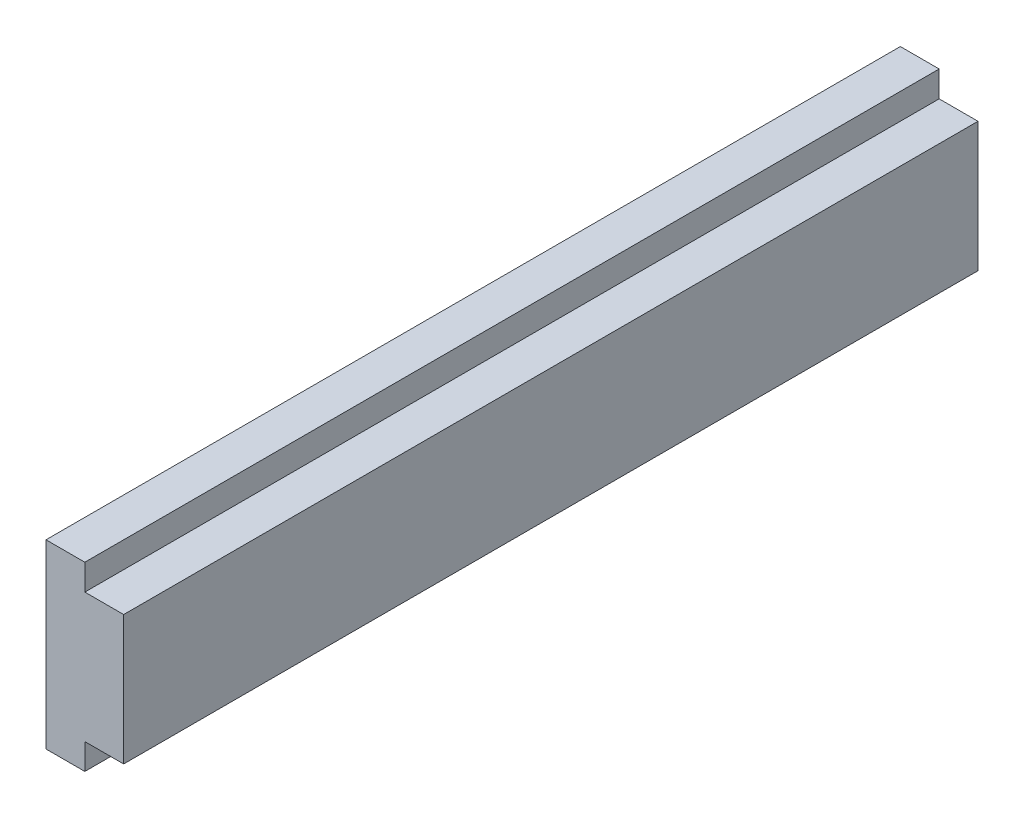
ISO-10303-21;
HEADER;
FILE_DESCRIPTION(('STEP AP214'),'2;1');
FILE_NAME('part.step','',(''),(''),'','','');
FILE_SCHEMA(('AUTOMOTIVE_DESIGN { 1 0 10303 214 1 1 1 1 }'));
ENDSEC;
DATA;
#1=APPLICATION_CONTEXT('core data for automotive mechanical design processes');
#2=APPLICATION_PROTOCOL_DEFINITION('international standard','automotive_design',2000,#1);
#3=PRODUCT_CONTEXT('',#1,'mechanical');
#4=PRODUCT('Part','Part','',(#3));
#5=PRODUCT_RELATED_PRODUCT_CATEGORY('part','',(#4));
#6=PRODUCT_DEFINITION_FORMATION('','',#4);
#7=PRODUCT_DEFINITION_CONTEXT('part definition',#1,'design');
#8=PRODUCT_DEFINITION('design','',#6,#7);
#9=PRODUCT_DEFINITION_SHAPE('','',#8);
#10=(LENGTH_UNIT() NAMED_UNIT(*) SI_UNIT(.MILLI.,.METRE.));
#11=(NAMED_UNIT(*) PLANE_ANGLE_UNIT() SI_UNIT($,.RADIAN.));
#12=(NAMED_UNIT(*) SI_UNIT($,.STERADIAN.) SOLID_ANGLE_UNIT());
#13=UNCERTAINTY_MEASURE_WITH_UNIT(LENGTH_MEASURE(1.E-05),#10,'distance_accuracy_value','');
#14=(GEOMETRIC_REPRESENTATION_CONTEXT(3) GLOBAL_UNCERTAINTY_ASSIGNED_CONTEXT((#13)) GLOBAL_UNIT_ASSIGNED_CONTEXT((#10,
#11,#12)) REPRESENTATION_CONTEXT('',''));
#15=CARTESIAN_POINT('',(0.,0.,0.));
#16=DIRECTION('',(0.,0.,1.));
#17=DIRECTION('',(1.,0.,0.));
#18=AXIS2_PLACEMENT_3D('',#15,#16,#17);
#19=CARTESIAN_POINT('',(0.,0.,66.));
#20=DIRECTION('',(0.,1.,0.));
#21=DIRECTION('',(0.,0.,1.));
#22=AXIS2_PLACEMENT_3D('',#19,#20,#21);
#23=PLANE('',#22);
#24=DIRECTION('',(1.,0.,0.));
#25=VECTOR('',#24,1.);
#26=CARTESIAN_POINT('',(0.,0.,0.));
#27=LINE('',#26,#25);
#28=CARTESIAN_POINT('',(0.,0.,0.));
#29=VERTEX_POINT('',#28);
#30=CARTESIAN_POINT('',(3.,0.,0.));
#31=VERTEX_POINT('',#30);
#32=EDGE_CURVE('E144',#29,#31,#27,.T.);
#33=ORIENTED_EDGE('',*,*,#32,.T.);
#34=DIRECTION('',(0.,0.,-1.));
#35=VECTOR('',#34,1.);
#36=CARTESIAN_POINT('',(3.,0.,66.));
#37=LINE('',#36,#35);
#38=CARTESIAN_POINT('',(3.,0.,66.));
#39=VERTEX_POINT('',#38);
#40=EDGE_CURVE('E11',#39,#31,#37,.T.);
#41=ORIENTED_EDGE('',*,*,#40,.F.);
#42=DIRECTION('',(1.,0.,0.));
#43=VECTOR('',#42,1.);
#44=CARTESIAN_POINT('',(0.,0.,66.));
#45=LINE('',#44,#43);
#46=CARTESIAN_POINT('',(0.,0.,66.));
#47=VERTEX_POINT('',#46);
#48=EDGE_CURVE('E169',#47,#39,#45,.T.);
#49=ORIENTED_EDGE('',*,*,#48,.F.);
#50=DIRECTION('',(0.,0.,-1.));
#51=VECTOR('',#50,1.);
#52=CARTESIAN_POINT('',(0.,0.,66.));
#53=LINE('',#52,#51);
#54=EDGE_CURVE('E58',#47,#29,#53,.T.);
#55=ORIENTED_EDGE('',*,*,#54,.T.);
#56=EDGE_LOOP('',(#33,#41,#49,#55));
#57=FACE_BOUND('',#56,.T.);
#58=ADVANCED_FACE('F41',(#57),#23,.F.);
#59=CARTESIAN_POINT('',(3.,0.,66.));
#60=DIRECTION('',(-1.,0.,0.));
#61=DIRECTION('',(0.,0.,1.));
#62=AXIS2_PLACEMENT_3D('',#59,#60,#61);
#63=PLANE('',#62);
#64=DIRECTION('',(0.,1.,0.));
#65=VECTOR('',#64,1.);
#66=CARTESIAN_POINT('',(3.,0.,0.));
#67=LINE('',#66,#65);
#68=CARTESIAN_POINT('',(3.,2.,0.));
#69=VERTEX_POINT('',#68);
#70=EDGE_CURVE('E147',#31,#69,#67,.T.);
#71=ORIENTED_EDGE('',*,*,#70,.T.);
#72=DIRECTION('',(0.,0.,-1.));
#73=VECTOR('',#72,1.);
#74=CARTESIAN_POINT('',(3.,2.,66.));
#75=LINE('',#74,#73);
#76=CARTESIAN_POINT('',(3.,2.,66.));
#77=VERTEX_POINT('',#76);
#78=EDGE_CURVE('E50',#77,#69,#75,.T.);
#79=ORIENTED_EDGE('',*,*,#78,.F.);
#80=DIRECTION('',(0.,1.,0.));
#81=VECTOR('',#80,1.);
#82=CARTESIAN_POINT('',(3.,0.,66.));
#83=LINE('',#82,#81);
#84=EDGE_CURVE('E96',#39,#77,#83,.T.);
#85=ORIENTED_EDGE('',*,*,#84,.F.);
#86=ORIENTED_EDGE('',*,*,#40,.T.);
#87=EDGE_LOOP('',(#71,#79,#85,#86));
#88=FACE_BOUND('',#87,.T.);
#89=ADVANCED_FACE('F205',(#88),#63,.F.);
#90=CARTESIAN_POINT('',(0.,2.,66.));
#91=DIRECTION('',(0.,1.,0.));
#92=DIRECTION('',(0.,0.,1.));
#93=AXIS2_PLACEMENT_3D('',#90,#91,#92);
#94=PLANE('',#93);
#95=DIRECTION('',(1.,0.,0.));
#96=VECTOR('',#95,1.);
#97=CARTESIAN_POINT('',(0.,2.,0.));
#98=LINE('',#97,#96);
#99=CARTESIAN_POINT('',(6.,2.,0.));
#100=VERTEX_POINT('',#99);
#101=EDGE_CURVE('E150',#69,#100,#98,.T.);
#102=ORIENTED_EDGE('',*,*,#101,.T.);
#103=DIRECTION('',(0.,0.,-1.));
#104=VECTOR('',#103,1.);
#105=CARTESIAN_POINT('',(6.,2.,66.));
#106=LINE('',#105,#104);
#107=CARTESIAN_POINT('',(6.,2.,66.));
#108=VERTEX_POINT('',#107);
#109=EDGE_CURVE('E179',#108,#100,#106,.T.);
#110=ORIENTED_EDGE('',*,*,#109,.F.);
#111=DIRECTION('',(1.,0.,0.));
#112=VECTOR('',#111,1.);
#113=CARTESIAN_POINT('',(0.,2.,66.));
#114=LINE('',#113,#112);
#115=EDGE_CURVE('E188',#77,#108,#114,.T.);
#116=ORIENTED_EDGE('',*,*,#115,.F.);
#117=ORIENTED_EDGE('',*,*,#78,.T.);
#118=EDGE_LOOP('',(#102,#110,#116,#117));
#119=FACE_BOUND('',#118,.T.);
#120=ADVANCED_FACE('F186',(#119),#94,.F.);
#121=CARTESIAN_POINT('',(6.,0.,66.));
#122=DIRECTION('',(1.,0.,0.));
#123=DIRECTION('',(0.,1.,0.));
#124=AXIS2_PLACEMENT_3D('',#121,#122,#123);
#125=PLANE('',#124);
#126=DIRECTION('',(0.,-1.,0.));
#127=VECTOR('',#126,1.);
#128=CARTESIAN_POINT('',(6.,0.,0.));
#129=LINE('',#128,#127);
#130=CARTESIAN_POINT('',(6.,12.,0.));
#131=VERTEX_POINT('',#130);
#132=EDGE_CURVE('E154',#131,#100,#129,.T.);
#133=ORIENTED_EDGE('',*,*,#132,.F.);
#134=DIRECTION('',(0.,0.,-1.));
#135=VECTOR('',#134,1.);
#136=CARTESIAN_POINT('',(6.,12.,66.));
#137=LINE('',#136,#135);
#138=CARTESIAN_POINT('',(6.,12.,66.));
#139=VERTEX_POINT('',#138);
#140=EDGE_CURVE('E176',#139,#131,#137,.T.);
#141=ORIENTED_EDGE('',*,*,#140,.F.);
#142=DIRECTION('',(0.,-1.,0.));
#143=VECTOR('',#142,1.);
#144=CARTESIAN_POINT('',(6.,0.,66.));
#145=LINE('',#144,#143);
#146=EDGE_CURVE('E196',#139,#108,#145,.T.);
#147=ORIENTED_EDGE('',*,*,#146,.T.);
#148=ORIENTED_EDGE('',*,*,#109,.T.);
#149=EDGE_LOOP('',(#133,#141,#147,#148));
#150=FACE_BOUND('',#149,.T.);
#151=ADVANCED_FACE('F194',(#150),#125,.T.);
#152=CARTESIAN_POINT('',(0.,12.,66.));
#153=DIRECTION('',(0.,1.,0.));
#154=DIRECTION('',(0.,0.,1.));
#155=AXIS2_PLACEMENT_3D('',#152,#153,#154);
#156=PLANE('',#155);
#157=DIRECTION('',(1.,0.,0.));
#158=VECTOR('',#157,1.);
#159=CARTESIAN_POINT('',(0.,12.,0.));
#160=LINE('',#159,#158);
#161=CARTESIAN_POINT('',(3.,12.,0.));
#162=VERTEX_POINT('',#161);
#163=EDGE_CURVE('E158',#162,#131,#160,.T.);
#164=ORIENTED_EDGE('',*,*,#163,.F.);
#165=DIRECTION('',(0.,0.,-1.));
#166=VECTOR('',#165,1.);
#167=CARTESIAN_POINT('',(3.,12.,66.));
#168=LINE('',#167,#166);
#169=CARTESIAN_POINT('',(3.,12.,66.));
#170=VERTEX_POINT('',#169);
#171=EDGE_CURVE('E133',#170,#162,#168,.T.);
#172=ORIENTED_EDGE('',*,*,#171,.F.);
#173=DIRECTION('',(1.,0.,0.));
#174=VECTOR('',#173,1.);
#175=CARTESIAN_POINT('',(0.,12.,66.));
#176=LINE('',#175,#174);
#177=EDGE_CURVE('E121',#170,#139,#176,.T.);
#178=ORIENTED_EDGE('',*,*,#177,.T.);
#179=ORIENTED_EDGE('',*,*,#140,.T.);
#180=EDGE_LOOP('',(#164,#172,#178,#179));
#181=FACE_BOUND('',#180,.T.);
#182=ADVANCED_FACE('F215',(#181),#156,.T.);
#183=CARTESIAN_POINT('',(3.,14.,0.));
#184=VERTEX_POINT('',#183);
#185=EDGE_CURVE('E129',#162,#184,#67,.T.);
#186=ORIENTED_EDGE('',*,*,#185,.T.);
#187=DIRECTION('',(0.,0.,-1.));
#188=VECTOR('',#187,1.);
#189=CARTESIAN_POINT('',(3.,14.,66.));
#190=LINE('',#189,#188);
#191=CARTESIAN_POINT('',(3.,14.,66.));
#192=VERTEX_POINT('',#191);
#193=EDGE_CURVE('E126',#192,#184,#190,.T.);
#194=ORIENTED_EDGE('',*,*,#193,.F.);
#195=EDGE_CURVE('E113',#170,#192,#83,.T.);
#196=ORIENTED_EDGE('',*,*,#195,.F.);
#197=ORIENTED_EDGE('',*,*,#171,.T.);
#198=EDGE_LOOP('',(#186,#194,#196,#197));
#199=FACE_BOUND('',#198,.T.);
#200=ADVANCED_FACE('F127',(#199),#63,.F.);
#201=CARTESIAN_POINT('',(0.,14.,66.));
#202=DIRECTION('',(0.,1.,0.));
#203=DIRECTION('',(0.,0.,1.));
#204=AXIS2_PLACEMENT_3D('',#201,#202,#203);
#205=PLANE('',#204);
#206=DIRECTION('',(1.,0.,0.));
#207=VECTOR('',#206,1.);
#208=CARTESIAN_POINT('',(0.,14.,0.));
#209=LINE('',#208,#207);
#210=CARTESIAN_POINT('',(0.,14.,0.));
#211=VERTEX_POINT('',#210);
#212=EDGE_CURVE('E162',#211,#184,#209,.T.);
#213=ORIENTED_EDGE('',*,*,#212,.F.);
#214=DIRECTION('',(0.,0.,-1.));
#215=VECTOR('',#214,1.);
#216=CARTESIAN_POINT('',(0.,14.,66.));
#217=LINE('',#216,#215);
#218=CARTESIAN_POINT('',(0.,14.,66.));
#219=VERTEX_POINT('',#218);
#220=EDGE_CURVE('E84',#219,#211,#217,.T.);
#221=ORIENTED_EDGE('',*,*,#220,.F.);
#222=DIRECTION('',(1.,0.,0.));
#223=VECTOR('',#222,1.);
#224=CARTESIAN_POINT('',(0.,14.,66.));
#225=LINE('',#224,#223);
#226=EDGE_CURVE('E118',#219,#192,#225,.T.);
#227=ORIENTED_EDGE('',*,*,#226,.T.);
#228=ORIENTED_EDGE('',*,*,#193,.T.);
#229=EDGE_LOOP('',(#213,#221,#227,#228));
#230=FACE_BOUND('',#229,.T.);
#231=ADVANCED_FACE('F135',(#230),#205,.T.);
#232=CARTESIAN_POINT('',(0.,0.,66.));
#233=DIRECTION('',(-1.,0.,0.));
#234=DIRECTION('',(0.,0.,1.));
#235=AXIS2_PLACEMENT_3D('',#232,#233,#234);
#236=PLANE('',#235);
#237=DIRECTION('',(0.,1.,0.));
#238=VECTOR('',#237,1.);
#239=CARTESIAN_POINT('',(0.,0.,0.));
#240=LINE('',#239,#238);
#241=EDGE_CURVE('E165',#29,#211,#240,.T.);
#242=ORIENTED_EDGE('',*,*,#241,.F.);
#243=ORIENTED_EDGE('',*,*,#54,.F.);
#244=DIRECTION('',(0.,1.,0.));
#245=VECTOR('',#244,1.);
#246=CARTESIAN_POINT('',(0.,0.,66.));
#247=LINE('',#246,#245);
#248=EDGE_CURVE('E137',#47,#219,#247,.T.);
#249=ORIENTED_EDGE('',*,*,#248,.T.);
#250=ORIENTED_EDGE('',*,*,#220,.T.);
#251=EDGE_LOOP('',(#242,#243,#249,#250));
#252=FACE_BOUND('',#251,.T.);
#253=ADVANCED_FACE('F220',(#252),#236,.T.);
#254=CARTESIAN_POINT('',(0.,0.,66.));
#255=DIRECTION('',(0.,0.,1.));
#256=DIRECTION('',(1.,0.,0.));
#257=AXIS2_PLACEMENT_3D('',#254,#255,#256);
#258=PLANE('',#257);
#259=ORIENTED_EDGE('',*,*,#48,.T.);
#260=ORIENTED_EDGE('',*,*,#84,.T.);
#261=ORIENTED_EDGE('',*,*,#115,.T.);
#262=ORIENTED_EDGE('',*,*,#146,.F.);
#263=ORIENTED_EDGE('',*,*,#177,.F.);
#264=ORIENTED_EDGE('',*,*,#195,.T.);
#265=ORIENTED_EDGE('',*,*,#226,.F.);
#266=ORIENTED_EDGE('',*,*,#248,.F.);
#267=EDGE_LOOP('',(#259,#260,#261,#262,#263,#264,#265,#266));
#268=FACE_BOUND('',#267,.T.);
#269=ADVANCED_FACE('F115',(#268),#258,.T.);
#270=CARTESIAN_POINT('',(0.,0.,0.));
#271=DIRECTION('',(0.,0.,1.));
#272=DIRECTION('',(1.,0.,0.));
#273=AXIS2_PLACEMENT_3D('',#270,#271,#272);
#274=PLANE('',#273);
#275=ORIENTED_EDGE('',*,*,#32,.F.);
#276=ORIENTED_EDGE('',*,*,#241,.T.);
#277=ORIENTED_EDGE('',*,*,#212,.T.);
#278=ORIENTED_EDGE('',*,*,#185,.F.);
#279=ORIENTED_EDGE('',*,*,#163,.T.);
#280=ORIENTED_EDGE('',*,*,#132,.T.);
#281=ORIENTED_EDGE('',*,*,#101,.F.);
#282=ORIENTED_EDGE('',*,*,#70,.F.);
#283=EDGE_LOOP('',(#275,#276,#277,#278,#279,#280,#281,#282));
#284=FACE_BOUND('',#283,.T.);
#285=ADVANCED_FACE('F190',(#284),#274,.F.);
#286=CLOSED_SHELL('',(#58,#89,#120,#151,#182,#200,#231,#253,#269,#285));
#287=MANIFOLD_SOLID_BREP('B2',#286);
#288=ADVANCED_BREP_SHAPE_REPRESENTATION('',(#18,#287),#14);
#289=SHAPE_DEFINITION_REPRESENTATION(#9,#288);
ENDSEC;
END-ISO-10303-21;
